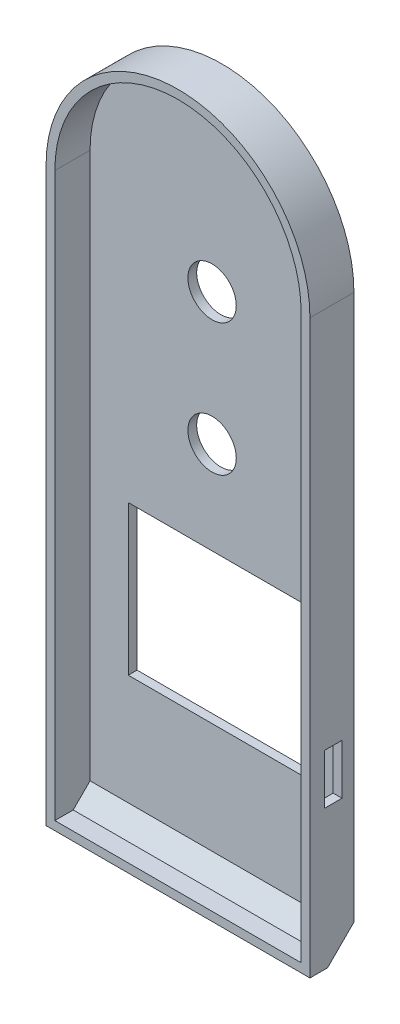
ISO-10303-21;
HEADER;
FILE_DESCRIPTION(('STEP AP214'),'2;1');
FILE_NAME('part.step','',(''),(''),'','','');
FILE_SCHEMA(('AUTOMOTIVE_DESIGN { 1 0 10303 214 1 1 1 1 }'));
ENDSEC;
DATA;
#1=APPLICATION_CONTEXT('core data for automotive mechanical design processes');
#2=APPLICATION_PROTOCOL_DEFINITION('international standard','automotive_design',2000,#1);
#3=PRODUCT_CONTEXT('',#1,'mechanical');
#4=PRODUCT('Part','Part','',(#3));
#5=PRODUCT_RELATED_PRODUCT_CATEGORY('part','',(#4));
#6=PRODUCT_DEFINITION_FORMATION('','',#4);
#7=PRODUCT_DEFINITION_CONTEXT('part definition',#1,'design');
#8=PRODUCT_DEFINITION('design','',#6,#7);
#9=PRODUCT_DEFINITION_SHAPE('','',#8);
#10=(LENGTH_UNIT() NAMED_UNIT(*) SI_UNIT(.MILLI.,.METRE.));
#11=(NAMED_UNIT(*) PLANE_ANGLE_UNIT() SI_UNIT($,.RADIAN.));
#12=(NAMED_UNIT(*) SI_UNIT($,.STERADIAN.) SOLID_ANGLE_UNIT());
#13=UNCERTAINTY_MEASURE_WITH_UNIT(LENGTH_MEASURE(1.E-05),#10,'distance_accuracy_value','');
#14=(GEOMETRIC_REPRESENTATION_CONTEXT(3) GLOBAL_UNCERTAINTY_ASSIGNED_CONTEXT((#13)) GLOBAL_UNIT_ASSIGNED_CONTEXT((#10,
#11,#12)) REPRESENTATION_CONTEXT('',''));
#15=CARTESIAN_POINT('',(0.,0.,0.));
#16=DIRECTION('',(0.,0.,1.));
#17=DIRECTION('',(1.,0.,0.));
#18=AXIS2_PLACEMENT_3D('',#15,#16,#17);
#19=CARTESIAN_POINT('',(0.126373264989783,12.0050046276189,5.));
#20=DIRECTION('',(-1.,0.,0.));
#21=DIRECTION('',(0.,-1.,0.));
#22=AXIS2_PLACEMENT_3D('',#19,#20,#21);
#23=PLANE('',#22);
#24=DIRECTION('',(0.,-0.707106781186548,0.707106781186547));
#25=VECTOR('',#24,1.);
#26=CARTESIAN_POINT('',(0.126373264989788,-21.494995372381,-28.5));
#27=LINE('',#26,#25);
#28=CARTESIAN_POINT('',(0.126373264989793,-49.9949953723811,0.));
#29=VERTEX_POINT('',#28);
#30=CARTESIAN_POINT('',(0.126373264989795,-52.9949953723811,2.99999999999998));
#31=VERTEX_POINT('',#30);
#32=EDGE_CURVE('E322',#29,#31,#27,.T.);
#33=ORIENTED_EDGE('',*,*,#32,.F.);
#34=DIRECTION('',(0.,1.,0.));
#35=VECTOR('',#34,1.);
#36=CARTESIAN_POINT('',(0.126373264989783,12.0050046276189,0.));
#37=LINE('',#36,#35);
#38=CARTESIAN_POINT('',(0.126373264989783,12.0050046276189,0.));
#39=VERTEX_POINT('',#38);
#40=EDGE_CURVE('E286',#29,#39,#37,.T.);
#41=ORIENTED_EDGE('',*,*,#40,.T.);
#42=DIRECTION('',(0.,0.,-1.));
#43=VECTOR('',#42,1.);
#44=CARTESIAN_POINT('',(0.126373264989783,12.0050046276189,5.));
#45=LINE('',#44,#43);
#46=CARTESIAN_POINT('',(0.126373264989783,12.0050046276189,5.));
#47=VERTEX_POINT('',#46);
#48=EDGE_CURVE('E292',#47,#39,#45,.T.);
#49=ORIENTED_EDGE('',*,*,#48,.F.);
#50=DIRECTION('',(0.,1.,0.));
#51=VECTOR('',#50,1.);
#52=CARTESIAN_POINT('',(0.126373264989783,12.0050046276189,5.));
#53=LINE('',#52,#51);
#54=CARTESIAN_POINT('',(0.126373264989793,-52.9949953723811,5.));
#55=VERTEX_POINT('',#54);
#56=EDGE_CURVE('E290',#55,#47,#53,.T.);
#57=ORIENTED_EDGE('',*,*,#56,.F.);
#58=DIRECTION('',(0.,0.,-1.));
#59=VECTOR('',#58,1.);
#60=CARTESIAN_POINT('',(0.126373264989793,-52.9949953723811,5.));
#61=LINE('',#60,#59);
#62=EDGE_CURVE('E301',#55,#31,#61,.T.);
#63=ORIENTED_EDGE('',*,*,#62,.T.);
#64=EDGE_LOOP('',(#33,#41,#49,#57,#63));
#65=FACE_BOUND('',#64,.T.);
#66=DIRECTION('',(0.,0.,1.));
#67=VECTOR('',#66,1.);
#68=CARTESIAN_POINT('',(0.126373264989791,-37.1143883484483,1.36194062957642));
#69=LINE('',#68,#67);
#70=CARTESIAN_POINT('',(0.126373264989791,-37.1143883484483,1.36194062957642));
#71=VERTEX_POINT('',#70);
#72=CARTESIAN_POINT('',(0.126373264989791,-37.1143883484483,3.36194062957642));
#73=VERTEX_POINT('',#72);
#74=EDGE_CURVE('E51',#71,#73,#69,.T.);
#75=ORIENTED_EDGE('',*,*,#74,.T.);
#76=DIRECTION('',(0.,1.,0.));
#77=VECTOR('',#76,1.);
#78=CARTESIAN_POINT('',(0.126373264989791,-37.1143883484483,3.36194062957642));
#79=LINE('',#78,#77);
#80=CARTESIAN_POINT('',(0.12637326498979,-31.4143883484483,3.36194062957642));
#81=VERTEX_POINT('',#80);
#82=EDGE_CURVE('E181',#73,#81,#79,.T.);
#83=ORIENTED_EDGE('',*,*,#82,.T.);
#84=DIRECTION('',(0.,0.,-1.));
#85=VECTOR('',#84,1.);
#86=CARTESIAN_POINT('',(0.12637326498979,-31.4143883484483,3.36194062957642));
#87=LINE('',#86,#85);
#88=CARTESIAN_POINT('',(0.12637326498979,-31.4143883484483,1.36194062957642));
#89=VERTEX_POINT('',#88);
#90=EDGE_CURVE('E187',#81,#89,#87,.T.);
#91=ORIENTED_EDGE('',*,*,#90,.T.);
#92=DIRECTION('',(0.,-1.,0.));
#93=VECTOR('',#92,1.);
#94=CARTESIAN_POINT('',(0.12637326498979,-31.4143883484483,1.36194062957642));
#95=LINE('',#94,#93);
#96=EDGE_CURVE('E190',#89,#71,#95,.T.);
#97=ORIENTED_EDGE('',*,*,#96,.T.);
#98=EDGE_LOOP('',(#75,#83,#91,#97));
#99=FACE_BOUND('',#98,.T.);
#100=ADVANCED_FACE('F36',(#65,#99),#23,.F.);
#101=CARTESIAN_POINT('',(-0.873626735010217,12.0050046276189,5.));
#102=DIRECTION('',(-1.,0.,0.));
#103=DIRECTION('',(0.,-1.,0.));
#104=AXIS2_PLACEMENT_3D('',#101,#102,#103);
#105=PLANE('',#104);
#106=DIRECTION('',(0.,-0.707106781186549,0.707106781186547));
#107=VECTOR('',#106,1.);
#108=CARTESIAN_POINT('',(-0.873626735010212,-21.0378885911944,-28.0428932188135));
#109=LINE('',#108,#107);
#110=CARTESIAN_POINT('',(-0.873626735010209,-50.080781810008,1.));
#111=VERTEX_POINT('',#110);
#112=CARTESIAN_POINT('',(-0.873626735010207,-51.9949953723811,2.91421356237311));
#113=VERTEX_POINT('',#112);
#114=EDGE_CURVE('E247',#111,#113,#109,.T.);
#115=ORIENTED_EDGE('',*,*,#114,.T.);
#116=DIRECTION('',(0.,0.,-1.));
#117=VECTOR('',#116,1.);
#118=CARTESIAN_POINT('',(-0.873626735010207,-51.9949953723811,5.));
#119=LINE('',#118,#117);
#120=CARTESIAN_POINT('',(-0.873626735010207,-51.9949953723811,5.));
#121=VERTEX_POINT('',#120);
#122=EDGE_CURVE('E264',#121,#113,#119,.T.);
#123=ORIENTED_EDGE('',*,*,#122,.F.);
#124=DIRECTION('',(0.,1.,0.));
#125=VECTOR('',#124,1.);
#126=CARTESIAN_POINT('',(-0.873626735010216,12.0050046276189,5.));
#127=LINE('',#126,#125);
#128=CARTESIAN_POINT('',(-0.873626735010217,12.0050046276189,5.));
#129=VERTEX_POINT('',#128);
#130=EDGE_CURVE('E265',#121,#129,#127,.T.);
#131=ORIENTED_EDGE('',*,*,#130,.T.);
#132=DIRECTION('',(0.,0.,-1.));
#133=VECTOR('',#132,1.);
#134=CARTESIAN_POINT('',(-0.873626735010216,12.0050046276189,5.));
#135=LINE('',#134,#133);
#136=CARTESIAN_POINT('',(-0.873626735010216,12.0050046276189,1.));
#137=VERTEX_POINT('',#136);
#138=EDGE_CURVE('E261',#129,#137,#135,.T.);
#139=ORIENTED_EDGE('',*,*,#138,.T.);
#140=DIRECTION('',(0.,1.,0.));
#141=VECTOR('',#140,1.);
#142=CARTESIAN_POINT('',(-0.873626735010216,12.0050046276189,1.));
#143=LINE('',#142,#141);
#144=EDGE_CURVE('E252',#111,#137,#143,.T.);
#145=ORIENTED_EDGE('',*,*,#144,.F.);
#146=EDGE_LOOP('',(#115,#123,#131,#139,#145));
#147=FACE_BOUND('',#146,.T.);
#148=DIRECTION('',(0.,-1.,0.));
#149=VECTOR('',#148,1.);
#150=CARTESIAN_POINT('',(-0.873626735010217,12.0050046276189,3.36194062957642));
#151=LINE('',#150,#149);
#152=CARTESIAN_POINT('',(-0.87362673501021,-31.4143883484483,3.36194062957642));
#153=VERTEX_POINT('',#152);
#154=CARTESIAN_POINT('',(-0.87362673501021,-37.1143883484483,3.36194062957642));
#155=VERTEX_POINT('',#154);
#156=EDGE_CURVE('E44',#153,#155,#151,.T.);
#157=ORIENTED_EDGE('',*,*,#156,.T.);
#158=DIRECTION('',(0.,0.,-1.));
#159=VECTOR('',#158,1.);
#160=CARTESIAN_POINT('',(-0.873626735010209,-37.1143883484483,5.));
#161=LINE('',#160,#159);
#162=CARTESIAN_POINT('',(-0.87362673501021,-37.1143883484483,1.36194062957642));
#163=VERTEX_POINT('',#162);
#164=EDGE_CURVE('E11',#155,#163,#161,.T.);
#165=ORIENTED_EDGE('',*,*,#164,.T.);
#166=DIRECTION('',(0.,1.,0.));
#167=VECTOR('',#166,1.);
#168=CARTESIAN_POINT('',(-0.873626735010217,12.0050046276189,1.36194062957643));
#169=LINE('',#168,#167);
#170=CARTESIAN_POINT('',(-0.87362673501021,-31.4143883484483,1.36194062957642));
#171=VERTEX_POINT('',#170);
#172=EDGE_CURVE('E334',#163,#171,#169,.T.);
#173=ORIENTED_EDGE('',*,*,#172,.T.);
#174=DIRECTION('',(0.,0.,1.));
#175=VECTOR('',#174,1.);
#176=CARTESIAN_POINT('',(-0.87362673501021,-31.4143883484483,5.));
#177=LINE('',#176,#175);
#178=EDGE_CURVE('E337',#171,#153,#177,.T.);
#179=ORIENTED_EDGE('',*,*,#178,.T.);
#180=EDGE_LOOP('',(#157,#165,#173,#179));
#181=FACE_BOUND('',#180,.T.);
#182=ADVANCED_FACE('F340',(#147,#181),#105,.T.);
#183=CARTESIAN_POINT('',(-14.8736267350102,12.0050046276189,0.));
#184=DIRECTION('',(0.,0.,-1.));
#185=DIRECTION('',(-1.,0.,0.));
#186=AXIS2_PLACEMENT_3D('',#183,#184,#185);
#187=PLANE('',#186);
#188=CARTESIAN_POINT('',(-15.,5.,0.));
#189=DIRECTION('',(0.,0.,1.));
#190=DIRECTION('',(1.,0.,0.));
#191=AXIS2_PLACEMENT_3D('',#188,#189,#190);
#192=CIRCLE('',#191,2.75);
#193=CARTESIAN_POINT('',(-12.25,5.,0.));
#194=VERTEX_POINT('',#193);
#195=EDGE_CURVE('E234',#194,#194,#192,.T.);
#196=ORIENTED_EDGE('',*,*,#195,.T.);
#197=EDGE_LOOP('',(#196));
#198=FACE_BOUND('',#197,.T.);
#199=CARTESIAN_POINT('',(-15.,-10.,0.));
#200=DIRECTION('',(0.,0.,1.));
#201=DIRECTION('',(1.,0.,0.));
#202=AXIS2_PLACEMENT_3D('',#199,#200,#201);
#203=CIRCLE('',#202,2.75);
#204=CARTESIAN_POINT('',(-12.25,-10.,0.));
#205=VERTEX_POINT('',#204);
#206=EDGE_CURVE('E240',#205,#205,#203,.T.);
#207=ORIENTED_EDGE('',*,*,#206,.T.);
#208=EDGE_LOOP('',(#207));
#209=FACE_BOUND('',#208,.T.);
#210=DIRECTION('',(-0.707106781186547,-0.707106781186548,0.));
#211=VECTOR('',#210,1.);
#212=CARTESIAN_POINT('',(23.6263732649898,-26.494995372381,0.));
#213=LINE('',#212,#211);
#214=CARTESIAN_POINT('',(-0.373626735010162,-50.4949953723811,0.));
#215=VERTEX_POINT('',#214);
#216=EDGE_CURVE('E316',#29,#215,#213,.T.);
#217=ORIENTED_EDGE('',*,*,#216,.T.);
#218=DIRECTION('',(-1.,0.,0.));
#219=VECTOR('',#218,1.);
#220=CARTESIAN_POINT('',(-26.8736267350102,-50.4949953723811,0.));
#221=LINE('',#220,#219);
#222=CARTESIAN_POINT('',(-29.3736267350102,-50.4949953723811,0.));
#223=VERTEX_POINT('',#222);
#224=EDGE_CURVE('E330',#215,#223,#221,.T.);
#225=ORIENTED_EDGE('',*,*,#224,.T.);
#226=DIRECTION('',(-0.707106781186547,0.707106781186548,0.));
#227=VECTOR('',#226,1.);
#228=CARTESIAN_POINT('',(-53.3736267350102,-26.494995372381,0.));
#229=LINE('',#228,#227);
#230=CARTESIAN_POINT('',(-29.8736267350102,-49.9949953723811,0.));
#231=VERTEX_POINT('',#230);
#232=EDGE_CURVE('E314',#223,#231,#229,.T.);
#233=ORIENTED_EDGE('',*,*,#232,.T.);
#234=DIRECTION('',(0.,-1.,0.));
#235=VECTOR('',#234,1.);
#236=CARTESIAN_POINT('',(-29.8736267350102,12.0050046276189,0.));
#237=LINE('',#236,#235);
#238=CARTESIAN_POINT('',(-29.8736267350102,12.0050046276189,0.));
#239=VERTEX_POINT('',#238);
#240=EDGE_CURVE('E295',#239,#231,#237,.T.);
#241=ORIENTED_EDGE('',*,*,#240,.F.);
#242=CARTESIAN_POINT('',(-14.8736267350102,12.0050046276189,0.));
#243=DIRECTION('',(0.,0.,1.));
#244=DIRECTION('',(-1.,0.,0.));
#245=AXIS2_PLACEMENT_3D('',#242,#243,#244);
#246=CIRCLE('',#245,15.);
#247=EDGE_CURVE('E281',#39,#239,#246,.T.);
#248=ORIENTED_EDGE('',*,*,#247,.F.);
#249=ORIENTED_EDGE('',*,*,#40,.F.);
#250=EDGE_LOOP('',(#217,#225,#233,#241,#248,#249));
#251=FACE_BOUND('',#250,.T.);
#252=DIRECTION('',(0.,-1.,0.));
#253=VECTOR('',#252,1.);
#254=CARTESIAN_POINT('',(-24.5277071463028,12.0050046276189,0.));
#255=LINE('',#254,#253);
#256=CARTESIAN_POINT('',(-24.5277071463028,-20.5094885382598,0.));
#257=VERTEX_POINT('',#256);
#258=CARTESIAN_POINT('',(-24.5277071463028,-37.5094885382598,0.));
#259=VERTEX_POINT('',#258);
#260=EDGE_CURVE('E225',#257,#259,#255,.T.);
#261=ORIENTED_EDGE('',*,*,#260,.T.);
#262=DIRECTION('',(1.,0.,0.));
#263=VECTOR('',#262,1.);
#264=CARTESIAN_POINT('',(-14.8736267350102,-37.5094885382598,0.));
#265=LINE('',#264,#263);
#266=CARTESIAN_POINT('',(-4.52770714630282,-37.5094885382598,0.));
#267=VERTEX_POINT('',#266);
#268=EDGE_CURVE('E228',#259,#267,#265,.T.);
#269=ORIENTED_EDGE('',*,*,#268,.T.);
#270=DIRECTION('',(0.,1.,0.));
#271=VECTOR('',#270,1.);
#272=CARTESIAN_POINT('',(-4.52770714630283,12.0050046276189,0.));
#273=LINE('',#272,#271);
#274=CARTESIAN_POINT('',(-4.52770714630283,-20.5094885382598,0.));
#275=VERTEX_POINT('',#274);
#276=EDGE_CURVE('E219',#267,#275,#273,.T.);
#277=ORIENTED_EDGE('',*,*,#276,.T.);
#278=DIRECTION('',(-1.,0.,0.));
#279=VECTOR('',#278,1.);
#280=CARTESIAN_POINT('',(-14.8736267350102,-20.5094885382598,0.));
#281=LINE('',#280,#279);
#282=EDGE_CURVE('E222',#275,#257,#281,.T.);
#283=ORIENTED_EDGE('',*,*,#282,.T.);
#284=EDGE_LOOP('',(#261,#269,#277,#283));
#285=FACE_BOUND('',#284,.T.);
#286=ADVANCED_FACE('F356',(#198,#209,#251,#285),#187,.T.);
#287=CARTESIAN_POINT('',(-14.8736267350102,12.0050046276189,1.));
#288=DIRECTION('',(0.,0.,-1.));
#289=DIRECTION('',(-1.,0.,0.));
#290=AXIS2_PLACEMENT_3D('',#287,#288,#289);
#291=PLANE('',#290);
#292=ORIENTED_EDGE('',*,*,#144,.T.);
#293=CARTESIAN_POINT('',(-14.8736267350102,12.0050046276189,1.));
#294=DIRECTION('',(0.,0.,-1.));
#295=DIRECTION('',(-1.,0.,0.));
#296=AXIS2_PLACEMENT_3D('',#293,#294,#295);
#297=CIRCLE('',#296,14.);
#298=CARTESIAN_POINT('',(-28.8736267350102,12.0050046276189,1.));
#299=VERTEX_POINT('',#298);
#300=EDGE_CURVE('E243',#137,#299,#297,.F.);
#301=ORIENTED_EDGE('',*,*,#300,.T.);
#302=DIRECTION('',(0.,-1.,0.));
#303=VECTOR('',#302,1.);
#304=CARTESIAN_POINT('',(-28.8736267350102,12.0050046276189,1.));
#305=LINE('',#304,#303);
#306=CARTESIAN_POINT('',(-28.8736267350102,-50.080781810008,1.));
#307=VERTEX_POINT('',#306);
#308=EDGE_CURVE('E249',#299,#307,#305,.T.);
#309=ORIENTED_EDGE('',*,*,#308,.T.);
#310=DIRECTION('',(-1.,0.,0.));
#311=VECTOR('',#310,1.);
#312=CARTESIAN_POINT('',(-14.8736267350102,-50.080781810008,1.));
#313=LINE('',#312,#311);
#314=EDGE_CURVE('E244',#111,#307,#313,.T.);
#315=ORIENTED_EDGE('',*,*,#314,.F.);
#316=EDGE_LOOP('',(#292,#301,#309,#315));
#317=FACE_BOUND('',#316,.T.);
#318=CARTESIAN_POINT('',(-15.,-10.,1.));
#319=DIRECTION('',(0.,0.,1.));
#320=DIRECTION('',(1.,0.,0.));
#321=AXIS2_PLACEMENT_3D('',#318,#319,#320);
#322=CIRCLE('',#321,2.74999999999999);
#323=CARTESIAN_POINT('',(-12.25,-10.,1.));
#324=VERTEX_POINT('',#323);
#325=EDGE_CURVE('E237',#324,#324,#322,.T.);
#326=ORIENTED_EDGE('',*,*,#325,.F.);
#327=EDGE_LOOP('',(#326));
#328=FACE_BOUND('',#327,.T.);
#329=CARTESIAN_POINT('',(-15.,5.,1.));
#330=DIRECTION('',(0.,0.,1.));
#331=DIRECTION('',(1.,0.,0.));
#332=AXIS2_PLACEMENT_3D('',#329,#330,#331);
#333=CIRCLE('',#332,2.74999999999999);
#334=CARTESIAN_POINT('',(-12.25,5.,1.));
#335=VERTEX_POINT('',#334);
#336=EDGE_CURVE('E231',#335,#335,#333,.T.);
#337=ORIENTED_EDGE('',*,*,#336,.F.);
#338=EDGE_LOOP('',(#337));
#339=FACE_BOUND('',#338,.T.);
#340=DIRECTION('',(-1.,0.,0.));
#341=VECTOR('',#340,1.);
#342=CARTESIAN_POINT('',(-4.52770714630282,-37.5094885382598,1.));
#343=LINE('',#342,#341);
#344=CARTESIAN_POINT('',(-4.52770714630282,-37.5094885382598,1.));
#345=VERTEX_POINT('',#344);
#346=CARTESIAN_POINT('',(-24.5277071463028,-37.5094885382598,1.));
#347=VERTEX_POINT('',#346);
#348=EDGE_CURVE('E177',#345,#347,#343,.T.);
#349=ORIENTED_EDGE('',*,*,#348,.T.);
#350=DIRECTION('',(0.,1.,0.));
#351=VECTOR('',#350,1.);
#352=CARTESIAN_POINT('',(-24.5277071463028,-37.5094885382598,1.));
#353=LINE('',#352,#351);
#354=CARTESIAN_POINT('',(-24.5277071463028,-20.5094885382598,1.));
#355=VERTEX_POINT('',#354);
#356=EDGE_CURVE('E201',#347,#355,#353,.T.);
#357=ORIENTED_EDGE('',*,*,#356,.T.);
#358=DIRECTION('',(1.,0.,0.));
#359=VECTOR('',#358,1.);
#360=CARTESIAN_POINT('',(-24.5277071463028,-20.5094885382598,1.));
#361=LINE('',#360,#359);
#362=CARTESIAN_POINT('',(-4.52770714630283,-20.5094885382598,1.));
#363=VERTEX_POINT('',#362);
#364=EDGE_CURVE('E204',#355,#363,#361,.T.);
#365=ORIENTED_EDGE('',*,*,#364,.T.);
#366=DIRECTION('',(0.,-1.,0.));
#367=VECTOR('',#366,1.);
#368=CARTESIAN_POINT('',(-4.52770714630283,-20.5094885382598,1.));
#369=LINE('',#368,#367);
#370=EDGE_CURVE('E207',#363,#345,#369,.T.);
#371=ORIENTED_EDGE('',*,*,#370,.T.);
#372=EDGE_LOOP('',(#349,#357,#365,#371));
#373=FACE_BOUND('',#372,.T.);
#374=ADVANCED_FACE('F377',(#317,#328,#339,#373),#291,.F.);
#375=CARTESIAN_POINT('',(-14.8736267350102,12.0050046276189,5.));
#376=DIRECTION('',(0.,0.,-1.));
#377=DIRECTION('',(-1.,0.,0.));
#378=AXIS2_PLACEMENT_3D('',#375,#376,#377);
#379=PLANE('',#378);
#380=CARTESIAN_POINT('',(-14.8736267350102,12.0050046276189,5.));
#381=DIRECTION('',(0.,0.,1.));
#382=DIRECTION('',(-1.,0.,0.));
#383=AXIS2_PLACEMENT_3D('',#380,#381,#382);
#384=CIRCLE('',#383,15.);
#385=CARTESIAN_POINT('',(-29.8736267350102,12.0050046276189,5.));
#386=VERTEX_POINT('',#385);
#387=EDGE_CURVE('E282',#47,#386,#384,.T.);
#388=ORIENTED_EDGE('',*,*,#387,.T.);
#389=DIRECTION('',(0.,-1.,0.));
#390=VECTOR('',#389,1.);
#391=CARTESIAN_POINT('',(-29.8736267350102,12.0050046276189,5.));
#392=LINE('',#391,#390);
#393=CARTESIAN_POINT('',(-29.8736267350102,-52.9949953723811,5.));
#394=VERTEX_POINT('',#393);
#395=EDGE_CURVE('E285',#386,#394,#392,.T.);
#396=ORIENTED_EDGE('',*,*,#395,.T.);
#397=DIRECTION('',(1.,0.,0.));
#398=VECTOR('',#397,1.);
#399=CARTESIAN_POINT('',(-29.8736267350102,-52.9949953723811,5.));
#400=LINE('',#399,#398);
#401=EDGE_CURVE('E288',#394,#55,#400,.T.);
#402=ORIENTED_EDGE('',*,*,#401,.T.);
#403=ORIENTED_EDGE('',*,*,#56,.T.);
#404=EDGE_LOOP('',(#388,#396,#402,#403));
#405=FACE_BOUND('',#404,.T.);
#406=CARTESIAN_POINT('',(-14.8736267350102,12.0050046276189,5.));
#407=DIRECTION('',(0.,0.,-1.));
#408=DIRECTION('',(-1.,0.,0.));
#409=AXIS2_PLACEMENT_3D('',#406,#407,#408);
#410=CIRCLE('',#409,14.);
#411=CARTESIAN_POINT('',(-28.8736267350102,12.0050046276189,5.));
#412=VERTEX_POINT('',#411);
#413=EDGE_CURVE('E256',#129,#412,#410,.F.);
#414=ORIENTED_EDGE('',*,*,#413,.F.);
#415=ORIENTED_EDGE('',*,*,#130,.F.);
#416=DIRECTION('',(1.,0.,0.));
#417=VECTOR('',#416,1.);
#418=CARTESIAN_POINT('',(-14.8736267350102,-51.9949953723811,5.));
#419=LINE('',#418,#417);
#420=CARTESIAN_POINT('',(-28.8736267350102,-51.9949953723811,5.));
#421=VERTEX_POINT('',#420);
#422=EDGE_CURVE('E275',#421,#121,#419,.T.);
#423=ORIENTED_EDGE('',*,*,#422,.F.);
#424=DIRECTION('',(0.,-1.,0.));
#425=VECTOR('',#424,1.);
#426=CARTESIAN_POINT('',(-28.8736267350102,12.0050046276189,5.));
#427=LINE('',#426,#425);
#428=EDGE_CURVE('E273',#412,#421,#427,.T.);
#429=ORIENTED_EDGE('',*,*,#428,.F.);
#430=EDGE_LOOP('',(#414,#415,#423,#429));
#431=FACE_BOUND('',#430,.T.);
#432=ADVANCED_FACE('F372',(#405,#431),#379,.F.);
#433=CARTESIAN_POINT('',(-14.8736267350102,12.0050046276189,5.));
#434=DIRECTION('',(0.,0.,-1.));
#435=DIRECTION('',(-1.,0.,0.));
#436=AXIS2_PLACEMENT_3D('',#433,#434,#435);
#437=CYLINDRICAL_SURFACE('',#436,15.);
#438=ORIENTED_EDGE('',*,*,#247,.T.);
#439=DIRECTION('',(0.,0.,-1.));
#440=VECTOR('',#439,1.);
#441=CARTESIAN_POINT('',(-29.8736267350102,12.0050046276189,5.));
#442=LINE('',#441,#440);
#443=EDGE_CURVE('E306',#386,#239,#442,.T.);
#444=ORIENTED_EDGE('',*,*,#443,.F.);
#445=ORIENTED_EDGE('',*,*,#387,.F.);
#446=ORIENTED_EDGE('',*,*,#48,.T.);
#447=EDGE_LOOP('',(#438,#444,#445,#446));
#448=FACE_BOUND('',#447,.T.);
#449=ADVANCED_FACE('F369',(#448),#437,.T.);
#450=CARTESIAN_POINT('',(-29.8736267350102,12.0050046276189,5.));
#451=DIRECTION('',(1.,0.,0.));
#452=DIRECTION('',(0.,1.,0.));
#453=AXIS2_PLACEMENT_3D('',#450,#451,#452);
#454=PLANE('',#453);
#455=DIRECTION('',(0.,0.707106781186548,-0.707106781186547));
#456=VECTOR('',#455,1.);
#457=CARTESIAN_POINT('',(-29.8736267350102,-21.494995372381,-28.5));
#458=LINE('',#457,#456);
#459=CARTESIAN_POINT('',(-29.8736267350102,-52.9949953723811,3.00000000000001));
#460=VERTEX_POINT('',#459);
#461=EDGE_CURVE('E309',#460,#231,#458,.T.);
#462=ORIENTED_EDGE('',*,*,#461,.F.);
#463=DIRECTION('',(0.,0.,-1.));
#464=VECTOR('',#463,1.);
#465=CARTESIAN_POINT('',(-29.8736267350102,-52.9949953723811,5.));
#466=LINE('',#465,#464);
#467=EDGE_CURVE('E303',#394,#460,#466,.T.);
#468=ORIENTED_EDGE('',*,*,#467,.F.);
#469=ORIENTED_EDGE('',*,*,#395,.F.);
#470=ORIENTED_EDGE('',*,*,#443,.T.);
#471=ORIENTED_EDGE('',*,*,#240,.T.);
#472=EDGE_LOOP('',(#462,#468,#469,#470,#471));
#473=FACE_BOUND('',#472,.T.);
#474=ADVANCED_FACE('F366',(#473),#454,.F.);
#475=CARTESIAN_POINT('',(-29.8736267350102,-52.9949953723811,5.));
#476=DIRECTION('',(0.,1.,0.));
#477=DIRECTION('',(0.,0.,1.));
#478=AXIS2_PLACEMENT_3D('',#475,#476,#477);
#479=PLANE('',#478);
#480=DIRECTION('',(-0.707106781186547,0.,0.707106781186548));
#481=VECTOR('',#480,1.);
#482=CARTESIAN_POINT('',(-30.8736267350102,-52.9949953723811,4.00000000000001));
#483=LINE('',#482,#481);
#484=CARTESIAN_POINT('',(-29.3736267350102,-52.9949953723811,2.50000000000002));
#485=VERTEX_POINT('',#484);
#486=EDGE_CURVE('E312',#485,#460,#483,.T.);
#487=ORIENTED_EDGE('',*,*,#486,.F.);
#488=DIRECTION('',(1.,0.,0.));
#489=VECTOR('',#488,1.);
#490=CARTESIAN_POINT('',(-2.87362673501019,-52.9949953723811,2.50000000000002));
#491=LINE('',#490,#489);
#492=CARTESIAN_POINT('',(-0.373626735010169,-52.9949953723811,2.50000000000002));
#493=VERTEX_POINT('',#492);
#494=EDGE_CURVE('E325',#485,#493,#491,.T.);
#495=ORIENTED_EDGE('',*,*,#494,.T.);
#496=DIRECTION('',(-0.707106781186548,0.,-0.707106781186548));
#497=VECTOR('',#496,1.);
#498=CARTESIAN_POINT('',(-13.8736267350102,-52.9949953723811,-11.));
#499=LINE('',#498,#497);
#500=EDGE_CURVE('E319',#31,#493,#499,.T.);
#501=ORIENTED_EDGE('',*,*,#500,.F.);
#502=ORIENTED_EDGE('',*,*,#62,.F.);
#503=ORIENTED_EDGE('',*,*,#401,.F.);
#504=ORIENTED_EDGE('',*,*,#467,.T.);
#505=EDGE_LOOP('',(#487,#495,#501,#502,#503,#504));
#506=FACE_BOUND('',#505,.T.);
#507=ADVANCED_FACE('F362',(#506),#479,.F.);
#508=CARTESIAN_POINT('',(-26.6228740357971,-26.6228740357971,-26.6228740357971));
#509=DIRECTION('',(-0.577350269189626,-0.577350269189625,-0.577350269189626));
#510=DIRECTION('',(-0.707106781186547,0.,0.707106781186548));
#511=AXIS2_PLACEMENT_3D('',#508,#509,#510);
#512=PLANE('',#511);
#513=ORIENTED_EDGE('',*,*,#232,.F.);
#514=DIRECTION('',(0.,-0.707106781186548,0.707106781186546));
#515=VECTOR('',#514,1.);
#516=CARTESIAN_POINT('',(-29.3736267350103,-25.2474976861905,-25.2474976861905));
#517=LINE('',#516,#515);
#518=EDGE_CURVE('E332',#223,#485,#517,.T.);
#519=ORIENTED_EDGE('',*,*,#518,.T.);
#520=ORIENTED_EDGE('',*,*,#486,.T.);
#521=ORIENTED_EDGE('',*,*,#461,.T.);
#522=EDGE_LOOP('',(#513,#519,#520,#521));
#523=FACE_BOUND('',#522,.T.);
#524=ADVANCED_FACE('F365',(#523),#512,.T.);
#525=CARTESIAN_POINT('',(16.7071228791236,-16.7071228791236,-16.7071228791236));
#526=DIRECTION('',(0.577350269189626,-0.577350269189625,-0.577350269189626));
#527=DIRECTION('',(-0.707106781186548,0.,-0.707106781186548));
#528=AXIS2_PLACEMENT_3D('',#525,#526,#527);
#529=PLANE('',#528);
#530=ORIENTED_EDGE('',*,*,#500,.T.);
#531=DIRECTION('',(0.,0.707106781186548,-0.707106781186547));
#532=VECTOR('',#531,1.);
#533=CARTESIAN_POINT('',(-0.373626735010145,-25.2474976861905,-25.2474976861905));
#534=LINE('',#533,#532);
#535=EDGE_CURVE('E328',#493,#215,#534,.T.);
#536=ORIENTED_EDGE('',*,*,#535,.T.);
#537=ORIENTED_EDGE('',*,*,#216,.F.);
#538=ORIENTED_EDGE('',*,*,#32,.T.);
#539=EDGE_LOOP('',(#530,#536,#537,#538));
#540=FACE_BOUND('',#539,.T.);
#541=ADVANCED_FACE('F396',(#540),#529,.T.);
#542=CARTESIAN_POINT('',(-29.8736267350102,-52.9949953723811,2.50000000000002));
#543=DIRECTION('',(0.,-0.707106781186547,-0.707106781186549));
#544=DIRECTION('',(-1.,0.,0.));
#545=AXIS2_PLACEMENT_3D('',#542,#543,#544);
#546=PLANE('',#545);
#547=ORIENTED_EDGE('',*,*,#518,.F.);
#548=ORIENTED_EDGE('',*,*,#224,.F.);
#549=ORIENTED_EDGE('',*,*,#535,.F.);
#550=ORIENTED_EDGE('',*,*,#494,.F.);
#551=EDGE_LOOP('',(#547,#548,#549,#550));
#552=FACE_BOUND('',#551,.T.);
#553=ADVANCED_FACE('F38',(#552),#546,.T.);
#554=CARTESIAN_POINT('',(-14.8736267350102,12.0050046276189,5.));
#555=DIRECTION('',(0.,0.,-1.));
#556=DIRECTION('',(-1.,0.,0.));
#557=AXIS2_PLACEMENT_3D('',#554,#555,#556);
#558=CYLINDRICAL_SURFACE('',#557,14.);
#559=ORIENTED_EDGE('',*,*,#300,.F.);
#560=ORIENTED_EDGE('',*,*,#138,.F.);
#561=ORIENTED_EDGE('',*,*,#413,.T.);
#562=DIRECTION('',(0.,0.,1.));
#563=VECTOR('',#562,1.);
#564=CARTESIAN_POINT('',(-28.8736267350102,12.0050046276189,5.));
#565=LINE('',#564,#563);
#566=EDGE_CURVE('E257',#412,#299,#565,.F.);
#567=ORIENTED_EDGE('',*,*,#566,.T.);
#568=EDGE_LOOP('',(#559,#560,#561,#567));
#569=FACE_BOUND('',#568,.T.);
#570=ADVANCED_FACE('F422',(#569),#558,.F.);
#571=CARTESIAN_POINT('',(-28.8736267350102,12.0050046276189,5.));
#572=DIRECTION('',(1.,0.,0.));
#573=DIRECTION('',(0.,1.,0.));
#574=AXIS2_PLACEMENT_3D('',#571,#572,#573);
#575=PLANE('',#574);
#576=ORIENTED_EDGE('',*,*,#308,.F.);
#577=ORIENTED_EDGE('',*,*,#566,.F.);
#578=ORIENTED_EDGE('',*,*,#428,.T.);
#579=DIRECTION('',(0.,0.,-1.));
#580=VECTOR('',#579,1.);
#581=CARTESIAN_POINT('',(-28.8736267350102,-51.9949953723811,5.));
#582=LINE('',#581,#580);
#583=CARTESIAN_POINT('',(-28.8736267350102,-51.9949953723811,2.91421356237311));
#584=VERTEX_POINT('',#583);
#585=EDGE_CURVE('E260',#421,#584,#582,.T.);
#586=ORIENTED_EDGE('',*,*,#585,.T.);
#587=DIRECTION('',(0.,-0.707106781186549,0.707106781186547));
#588=VECTOR('',#587,1.);
#589=CARTESIAN_POINT('',(-28.8736267350102,-52.2878885911945,3.20710678118656));
#590=LINE('',#589,#588);
#591=EDGE_CURVE('E279',#307,#584,#590,.T.);
#592=ORIENTED_EDGE('',*,*,#591,.F.);
#593=EDGE_LOOP('',(#576,#577,#578,#586,#592));
#594=FACE_BOUND('',#593,.T.);
#595=ADVANCED_FACE('F418',(#594),#575,.T.);
#596=CARTESIAN_POINT('',(-29.8736267350102,-51.9949953723811,5.));
#597=DIRECTION('',(0.,1.,0.));
#598=DIRECTION('',(0.,0.,1.));
#599=AXIS2_PLACEMENT_3D('',#596,#597,#598);
#600=PLANE('',#599);
#601=ORIENTED_EDGE('',*,*,#585,.F.);
#602=ORIENTED_EDGE('',*,*,#422,.T.);
#603=ORIENTED_EDGE('',*,*,#122,.T.);
#604=DIRECTION('',(1.,0.,0.));
#605=VECTOR('',#604,1.);
#606=CARTESIAN_POINT('',(-29.8736267350102,-51.9949953723811,2.91421356237311));
#607=LINE('',#606,#605);
#608=EDGE_CURVE('E248',#584,#113,#607,.T.);
#609=ORIENTED_EDGE('',*,*,#608,.F.);
#610=EDGE_LOOP('',(#601,#602,#603,#609));
#611=FACE_BOUND('',#610,.T.);
#612=ADVANCED_FACE('F413',(#611),#600,.T.);
#613=CARTESIAN_POINT('',(-29.8736267350102,-52.2878885911945,3.20710678118656));
#614=DIRECTION('',(0.,-0.707106781186547,-0.707106781186549));
#615=DIRECTION('',(-1.,0.,0.));
#616=AXIS2_PLACEMENT_3D('',#613,#614,#615);
#617=PLANE('',#616);
#618=ORIENTED_EDGE('',*,*,#591,.T.);
#619=ORIENTED_EDGE('',*,*,#608,.T.);
#620=ORIENTED_EDGE('',*,*,#114,.F.);
#621=ORIENTED_EDGE('',*,*,#314,.T.);
#622=EDGE_LOOP('',(#618,#619,#620,#621));
#623=FACE_BOUND('',#622,.T.);
#624=ADVANCED_FACE('F410',(#623),#617,.F.);
#625=CARTESIAN_POINT('',(-15.,-10.,1.));
#626=DIRECTION('',(0.,0.,1.));
#627=DIRECTION('',(1.,0.,0.));
#628=AXIS2_PLACEMENT_3D('',#625,#626,#627);
#629=CYLINDRICAL_SURFACE('',#628,2.74999999999999);
#630=ORIENTED_EDGE('',*,*,#206,.F.);
#631=EDGE_LOOP('',(#630));
#632=FACE_BOUND('',#631,.T.);
#633=ORIENTED_EDGE('',*,*,#325,.T.);
#634=EDGE_LOOP('',(#633));
#635=FACE_BOUND('',#634,.T.);
#636=ADVANCED_FACE('F412',(#632,#635),#629,.F.);
#637=CARTESIAN_POINT('',(-15.,5.,1.));
#638=DIRECTION('',(0.,0.,1.));
#639=DIRECTION('',(1.,0.,0.));
#640=AXIS2_PLACEMENT_3D('',#637,#638,#639);
#641=CYLINDRICAL_SURFACE('',#640,2.74999999999999);
#642=ORIENTED_EDGE('',*,*,#195,.F.);
#643=EDGE_LOOP('',(#642));
#644=FACE_BOUND('',#643,.T.);
#645=ORIENTED_EDGE('',*,*,#336,.T.);
#646=EDGE_LOOP('',(#645));
#647=FACE_BOUND('',#646,.T.);
#648=ADVANCED_FACE('F432',(#644,#647),#641,.F.);
#649=CARTESIAN_POINT('',(-4.52770714630282,-37.5094885382598,-9.));
#650=DIRECTION('',(0.,1.,0.));
#651=DIRECTION('',(0.,0.,1.));
#652=AXIS2_PLACEMENT_3D('',#649,#650,#651);
#653=PLANE('',#652);
#654=DIRECTION('',(0.,0.,1.));
#655=VECTOR('',#654,1.);
#656=CARTESIAN_POINT('',(-24.5277071463028,-37.5094885382598,-9.));
#657=LINE('',#656,#655);
#658=EDGE_CURVE('E217',#259,#347,#657,.T.);
#659=ORIENTED_EDGE('',*,*,#658,.T.);
#660=ORIENTED_EDGE('',*,*,#348,.F.);
#661=DIRECTION('',(0.,0.,1.));
#662=VECTOR('',#661,1.);
#663=CARTESIAN_POINT('',(-4.52770714630282,-37.5094885382598,-9.));
#664=LINE('',#663,#662);
#665=EDGE_CURVE('E210',#267,#345,#664,.T.);
#666=ORIENTED_EDGE('',*,*,#665,.F.);
#667=ORIENTED_EDGE('',*,*,#268,.F.);
#668=EDGE_LOOP('',(#659,#660,#666,#667));
#669=FACE_BOUND('',#668,.T.);
#670=ADVANCED_FACE('F436',(#669),#653,.T.);
#671=CARTESIAN_POINT('',(-24.5277071463028,-37.5094885382598,-9.));
#672=DIRECTION('',(1.,0.,0.));
#673=DIRECTION('',(0.,0.,-1.));
#674=AXIS2_PLACEMENT_3D('',#671,#672,#673);
#675=PLANE('',#674);
#676=DIRECTION('',(0.,0.,1.));
#677=VECTOR('',#676,1.);
#678=CARTESIAN_POINT('',(-24.5277071463028,-20.5094885382598,-9.));
#679=LINE('',#678,#677);
#680=EDGE_CURVE('E215',#257,#355,#679,.T.);
#681=ORIENTED_EDGE('',*,*,#680,.T.);
#682=ORIENTED_EDGE('',*,*,#356,.F.);
#683=ORIENTED_EDGE('',*,*,#658,.F.);
#684=ORIENTED_EDGE('',*,*,#260,.F.);
#685=EDGE_LOOP('',(#681,#682,#683,#684));
#686=FACE_BOUND('',#685,.T.);
#687=ADVANCED_FACE('F440',(#686),#675,.T.);
#688=CARTESIAN_POINT('',(-24.5277071463028,-20.5094885382598,-9.));
#689=DIRECTION('',(0.,-1.,0.));
#690=DIRECTION('',(0.,0.,-1.));
#691=AXIS2_PLACEMENT_3D('',#688,#689,#690);
#692=PLANE('',#691);
#693=DIRECTION('',(0.,0.,1.));
#694=VECTOR('',#693,1.);
#695=CARTESIAN_POINT('',(-4.52770714630283,-20.5094885382598,-9.));
#696=LINE('',#695,#694);
#697=EDGE_CURVE('E213',#275,#363,#696,.T.);
#698=ORIENTED_EDGE('',*,*,#697,.T.);
#699=ORIENTED_EDGE('',*,*,#364,.F.);
#700=ORIENTED_EDGE('',*,*,#680,.F.);
#701=ORIENTED_EDGE('',*,*,#282,.F.);
#702=EDGE_LOOP('',(#698,#699,#700,#701));
#703=FACE_BOUND('',#702,.T.);
#704=ADVANCED_FACE('F444',(#703),#692,.T.);
#705=CARTESIAN_POINT('',(-4.52770714630283,-20.5094885382598,-9.));
#706=DIRECTION('',(-1.,0.,0.));
#707=DIRECTION('',(0.,-1.,0.));
#708=AXIS2_PLACEMENT_3D('',#705,#706,#707);
#709=PLANE('',#708);
#710=ORIENTED_EDGE('',*,*,#665,.T.);
#711=ORIENTED_EDGE('',*,*,#370,.F.);
#712=ORIENTED_EDGE('',*,*,#697,.F.);
#713=ORIENTED_EDGE('',*,*,#276,.F.);
#714=EDGE_LOOP('',(#710,#711,#712,#713));
#715=FACE_BOUND('',#714,.T.);
#716=ADVANCED_FACE('F448',(#715),#709,.T.);
#717=CARTESIAN_POINT('',(-9.87362673501021,-37.1143883484483,1.36194062957642));
#718=DIRECTION('',(0.,1.,0.));
#719=DIRECTION('',(-1.,0.,0.));
#720=AXIS2_PLACEMENT_3D('',#717,#718,#719);
#721=PLANE('',#720);
#722=DIRECTION('',(1.,0.,0.));
#723=VECTOR('',#722,1.);
#724=CARTESIAN_POINT('',(-9.87362673501021,-37.1143883484483,3.36194062957642));
#725=LINE('',#724,#723);
#726=EDGE_CURVE('E172',#155,#73,#725,.T.);
#727=ORIENTED_EDGE('',*,*,#726,.T.);
#728=ORIENTED_EDGE('',*,*,#74,.F.);
#729=DIRECTION('',(1.,0.,0.));
#730=VECTOR('',#729,1.);
#731=CARTESIAN_POINT('',(-9.87362673501021,-37.1143883484483,1.36194062957642));
#732=LINE('',#731,#730);
#733=EDGE_CURVE('E195',#163,#71,#732,.T.);
#734=ORIENTED_EDGE('',*,*,#733,.F.);
#735=ORIENTED_EDGE('',*,*,#164,.F.);
#736=EDGE_LOOP('',(#727,#728,#734,#735));
#737=FACE_BOUND('',#736,.T.);
#738=ADVANCED_FACE('F174',(#737),#721,.T.);
#739=CARTESIAN_POINT('',(-9.87362673501021,-37.1143883484483,3.36194062957642));
#740=DIRECTION('',(0.,0.,-1.));
#741=DIRECTION('',(-1.,0.,0.));
#742=AXIS2_PLACEMENT_3D('',#739,#740,#741);
#743=PLANE('',#742);
#744=DIRECTION('',(1.,0.,0.));
#745=VECTOR('',#744,1.);
#746=CARTESIAN_POINT('',(-9.87362673501021,-31.4143883484483,3.36194062957642));
#747=LINE('',#746,#745);
#748=EDGE_CURVE('E178',#153,#81,#747,.T.);
#749=ORIENTED_EDGE('',*,*,#748,.T.);
#750=ORIENTED_EDGE('',*,*,#82,.F.);
#751=ORIENTED_EDGE('',*,*,#726,.F.);
#752=ORIENTED_EDGE('',*,*,#156,.F.);
#753=EDGE_LOOP('',(#749,#750,#751,#752));
#754=FACE_BOUND('',#753,.T.);
#755=ADVANCED_FACE('F182',(#754),#743,.T.);
#756=CARTESIAN_POINT('',(-9.87362673501021,-31.4143883484483,3.36194062957642));
#757=DIRECTION('',(0.,-1.,0.));
#758=DIRECTION('',(1.,0.,0.));
#759=AXIS2_PLACEMENT_3D('',#756,#757,#758);
#760=PLANE('',#759);
#761=DIRECTION('',(1.,0.,0.));
#762=VECTOR('',#761,1.);
#763=CARTESIAN_POINT('',(-9.87362673501021,-31.4143883484483,1.36194062957642));
#764=LINE('',#763,#762);
#765=EDGE_CURVE('E59',#171,#89,#764,.T.);
#766=ORIENTED_EDGE('',*,*,#765,.T.);
#767=ORIENTED_EDGE('',*,*,#90,.F.);
#768=ORIENTED_EDGE('',*,*,#748,.F.);
#769=ORIENTED_EDGE('',*,*,#178,.F.);
#770=EDGE_LOOP('',(#766,#767,#768,#769));
#771=FACE_BOUND('',#770,.T.);
#772=ADVANCED_FACE('F342',(#771),#760,.T.);
#773=CARTESIAN_POINT('',(-9.87362673501021,-31.4143883484483,1.36194062957642));
#774=DIRECTION('',(0.,0.,1.));
#775=DIRECTION('',(0.,-1.,0.));
#776=AXIS2_PLACEMENT_3D('',#773,#774,#775);
#777=PLANE('',#776);
#778=ORIENTED_EDGE('',*,*,#733,.T.);
#779=ORIENTED_EDGE('',*,*,#96,.F.);
#780=ORIENTED_EDGE('',*,*,#765,.F.);
#781=ORIENTED_EDGE('',*,*,#172,.F.);
#782=EDGE_LOOP('',(#778,#779,#780,#781));
#783=FACE_BOUND('',#782,.T.);
#784=ADVANCED_FACE('F343',(#783),#777,.T.);
#785=CLOSED_SHELL('',(#100,#182,#286,#374,#432,#449,#474,#507,#524,#541,#553,#570,#595,#612,
#624,#636,#648,#670,#687,#704,#716,#738,#755,#772,#784));
#786=MANIFOLD_SOLID_BREP('B2',#785);
#787=ADVANCED_BREP_SHAPE_REPRESENTATION('',(#18,#786),#14);
#788=SHAPE_DEFINITION_REPRESENTATION(#9,#787);
ENDSEC;
END-ISO-10303-21;
